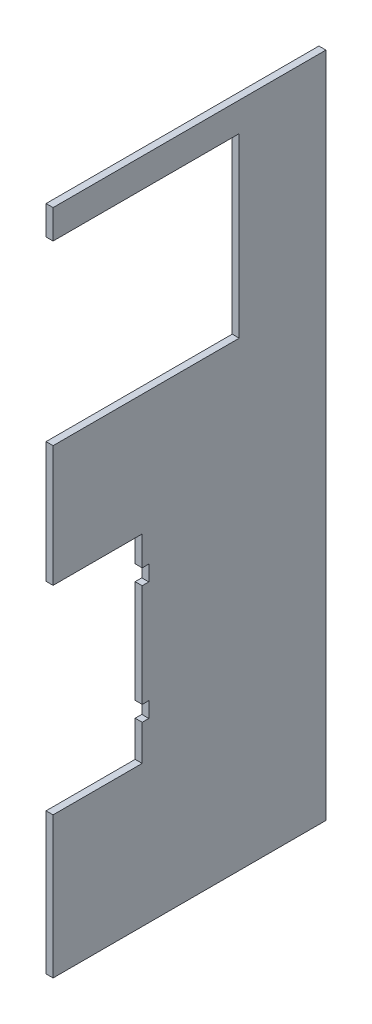
ISO-10303-21;
HEADER;
FILE_DESCRIPTION(('STEP AP214'),'2;1');
FILE_NAME('part.step','',(''),(''),'','','');
FILE_SCHEMA(('AUTOMOTIVE_DESIGN { 1 0 10303 214 1 1 1 1 }'));
ENDSEC;
DATA;
#1=APPLICATION_CONTEXT('core data for automotive mechanical design processes');
#2=APPLICATION_PROTOCOL_DEFINITION('international standard','automotive_design',2000,#1);
#3=PRODUCT_CONTEXT('',#1,'mechanical');
#4=PRODUCT('Part','Part','',(#3));
#5=PRODUCT_RELATED_PRODUCT_CATEGORY('part','',(#4));
#6=PRODUCT_DEFINITION_FORMATION('','',#4);
#7=PRODUCT_DEFINITION_CONTEXT('part definition',#1,'design');
#8=PRODUCT_DEFINITION('design','',#6,#7);
#9=PRODUCT_DEFINITION_SHAPE('','',#8);
#10=(LENGTH_UNIT() NAMED_UNIT(*) SI_UNIT(.MILLI.,.METRE.));
#11=(NAMED_UNIT(*) PLANE_ANGLE_UNIT() SI_UNIT($,.RADIAN.));
#12=(NAMED_UNIT(*) SI_UNIT($,.STERADIAN.) SOLID_ANGLE_UNIT());
#13=UNCERTAINTY_MEASURE_WITH_UNIT(LENGTH_MEASURE(1.E-05),#10,'distance_accuracy_value','');
#14=(GEOMETRIC_REPRESENTATION_CONTEXT(3) GLOBAL_UNCERTAINTY_ASSIGNED_CONTEXT((#13)) GLOBAL_UNIT_ASSIGNED_CONTEXT((#10,
#11,#12)) REPRESENTATION_CONTEXT('',''));
#15=CARTESIAN_POINT('',(0.,0.,0.));
#16=DIRECTION('',(0.,0.,1.));
#17=DIRECTION('',(1.,0.,0.));
#18=AXIS2_PLACEMENT_3D('',#15,#16,#17);
#19=CARTESIAN_POINT('',(1.,5.85000000000012,42.25));
#20=DIRECTION('',(0.,0.,1.));
#21=DIRECTION('',(0.,-1.,0.));
#22=AXIS2_PLACEMENT_3D('',#19,#20,#21);
#23=PLANE('',#22);
#24=DIRECTION('',(1.,0.,0.));
#25=VECTOR('',#24,1.);
#26=CARTESIAN_POINT('',(1.,25.9691599433872,42.25));
#27=LINE('',#26,#25);
#28=CARTESIAN_POINT('',(0.,25.9691599433872,42.25));
#29=VERTEX_POINT('',#28);
#30=CARTESIAN_POINT('',(1.,25.9691599433872,42.25));
#31=VERTEX_POINT('',#30);
#32=EDGE_CURVE('E282',#29,#31,#27,.T.);
#33=ORIENTED_EDGE('',*,*,#32,.F.);
#34=DIRECTION('',(0.,1.,0.));
#35=VECTOR('',#34,1.);
#36=CARTESIAN_POINT('',(0.,100.85,42.25));
#37=LINE('',#36,#35);
#38=CARTESIAN_POINT('',(0.,5.85000000000012,42.25));
#39=VERTEX_POINT('',#38);
#40=EDGE_CURVE('E285',#39,#29,#37,.T.);
#41=ORIENTED_EDGE('',*,*,#40,.F.);
#42=DIRECTION('',(-1.,0.,0.));
#43=VECTOR('',#42,1.);
#44=CARTESIAN_POINT('',(1.,5.85000000000012,42.25));
#45=LINE('',#44,#43);
#46=CARTESIAN_POINT('',(1.,5.85000000000012,42.25));
#47=VERTEX_POINT('',#46);
#48=EDGE_CURVE('E311',#47,#39,#45,.T.);
#49=ORIENTED_EDGE('',*,*,#48,.F.);
#50=DIRECTION('',(0.,1.,0.));
#51=VECTOR('',#50,1.);
#52=CARTESIAN_POINT('',(1.,5.85000000000012,42.25));
#53=LINE('',#52,#51);
#54=EDGE_CURVE('E302',#47,#31,#53,.T.);
#55=ORIENTED_EDGE('',*,*,#54,.T.);
#56=EDGE_LOOP('',(#33,#41,#49,#55));
#57=FACE_BOUND('',#56,.T.);
#58=ADVANCED_FACE('F32',(#57),#23,.T.);
#59=DIRECTION('',(-1.,0.,0.));
#60=VECTOR('',#59,1.);
#61=CARTESIAN_POINT('',(1.,96.7206720583192,42.25));
#62=LINE('',#61,#60);
#63=CARTESIAN_POINT('',(1.,96.7206720583192,42.25));
#64=VERTEX_POINT('',#63);
#65=CARTESIAN_POINT('',(0.,96.7206720583192,42.25));
#66=VERTEX_POINT('',#65);
#67=EDGE_CURVE('E279',#64,#66,#62,.T.);
#68=ORIENTED_EDGE('',*,*,#67,.F.);
#69=CARTESIAN_POINT('',(1.,100.85,42.25));
#70=VERTEX_POINT('',#69);
#71=EDGE_CURVE('E301',#64,#70,#53,.T.);
#72=ORIENTED_EDGE('',*,*,#71,.T.);
#73=DIRECTION('',(-1.,0.,0.));
#74=VECTOR('',#73,1.);
#75=CARTESIAN_POINT('',(1.,100.85,42.25));
#76=LINE('',#75,#74);
#77=CARTESIAN_POINT('',(0.,100.85,42.25));
#78=VERTEX_POINT('',#77);
#79=EDGE_CURVE('E316',#70,#78,#76,.T.);
#80=ORIENTED_EDGE('',*,*,#79,.T.);
#81=EDGE_CURVE('E284',#66,#78,#37,.T.);
#82=ORIENTED_EDGE('',*,*,#81,.F.);
#83=EDGE_LOOP('',(#68,#72,#80,#82));
#84=FACE_BOUND('',#83,.T.);
#85=ADVANCED_FACE('F327',(#84),#23,.T.);
#86=CARTESIAN_POINT('',(1.,5.85000000000011,3.40000000000003));
#87=DIRECTION('',(0.,-1.,0.));
#88=DIRECTION('',(0.,0.,-1.));
#89=AXIS2_PLACEMENT_3D('',#86,#87,#88);
#90=PLANE('',#89);
#91=ORIENTED_EDGE('',*,*,#48,.T.);
#92=DIRECTION('',(0.,0.,1.));
#93=VECTOR('',#92,1.);
#94=CARTESIAN_POINT('',(0.,5.85000000000012,42.25));
#95=LINE('',#94,#93);
#96=CARTESIAN_POINT('',(0.,5.85000000000011,3.40000000000002));
#97=VERTEX_POINT('',#96);
#98=EDGE_CURVE('E295',#97,#39,#95,.T.);
#99=ORIENTED_EDGE('',*,*,#98,.F.);
#100=DIRECTION('',(-1.,0.,0.));
#101=VECTOR('',#100,1.);
#102=CARTESIAN_POINT('',(1.,5.85000000000011,3.40000000000003));
#103=LINE('',#102,#101);
#104=CARTESIAN_POINT('',(1.,5.85000000000011,3.40000000000003));
#105=VERTEX_POINT('',#104);
#106=EDGE_CURVE('E312',#105,#97,#103,.T.);
#107=ORIENTED_EDGE('',*,*,#106,.F.);
#108=DIRECTION('',(0.,0.,1.));
#109=VECTOR('',#108,1.);
#110=CARTESIAN_POINT('',(1.,5.85000000000011,3.40000000000003));
#111=LINE('',#110,#109);
#112=EDGE_CURVE('E298',#105,#47,#111,.T.);
#113=ORIENTED_EDGE('',*,*,#112,.T.);
#114=EDGE_LOOP('',(#91,#99,#107,#113));
#115=FACE_BOUND('',#114,.T.);
#116=ADVANCED_FACE('F34',(#115),#90,.T.);
#117=CARTESIAN_POINT('',(1.,100.85,3.40000000000002));
#118=DIRECTION('',(0.,0.,-1.));
#119=DIRECTION('',(0.,1.,0.));
#120=AXIS2_PLACEMENT_3D('',#117,#118,#119);
#121=PLANE('',#120);
#122=ORIENTED_EDGE('',*,*,#106,.T.);
#123=DIRECTION('',(0.,-1.,0.));
#124=VECTOR('',#123,1.);
#125=CARTESIAN_POINT('',(0.,5.85000000000011,3.40000000000002));
#126=LINE('',#125,#124);
#127=CARTESIAN_POINT('',(0.,100.85,3.40000000000002));
#128=VERTEX_POINT('',#127);
#129=EDGE_CURVE('E292',#128,#97,#126,.T.);
#130=ORIENTED_EDGE('',*,*,#129,.F.);
#131=DIRECTION('',(-1.,0.,0.));
#132=VECTOR('',#131,1.);
#133=CARTESIAN_POINT('',(1.,100.85,3.40000000000002));
#134=LINE('',#133,#132);
#135=CARTESIAN_POINT('',(1.,100.85,3.40000000000002));
#136=VERTEX_POINT('',#135);
#137=EDGE_CURVE('E314',#136,#128,#134,.T.);
#138=ORIENTED_EDGE('',*,*,#137,.F.);
#139=DIRECTION('',(0.,-1.,0.));
#140=VECTOR('',#139,1.);
#141=CARTESIAN_POINT('',(1.,100.85,3.40000000000002));
#142=LINE('',#141,#140);
#143=EDGE_CURVE('E308',#136,#105,#142,.T.);
#144=ORIENTED_EDGE('',*,*,#143,.T.);
#145=EDGE_LOOP('',(#122,#130,#138,#144));
#146=FACE_BOUND('',#145,.T.);
#147=ADVANCED_FACE('F366',(#146),#121,.T.);
#148=CARTESIAN_POINT('',(1.,100.85,42.25));
#149=DIRECTION('',(0.,1.,0.));
#150=DIRECTION('',(0.,0.,1.));
#151=AXIS2_PLACEMENT_3D('',#148,#149,#150);
#152=PLANE('',#151);
#153=ORIENTED_EDGE('',*,*,#137,.T.);
#154=DIRECTION('',(0.,0.,-1.));
#155=VECTOR('',#154,1.);
#156=CARTESIAN_POINT('',(0.,100.85,3.40000000000002));
#157=LINE('',#156,#155);
#158=EDGE_CURVE('E288',#78,#128,#157,.T.);
#159=ORIENTED_EDGE('',*,*,#158,.F.);
#160=ORIENTED_EDGE('',*,*,#79,.F.);
#161=DIRECTION('',(0.,0.,-1.));
#162=VECTOR('',#161,1.);
#163=CARTESIAN_POINT('',(1.,100.85,42.25));
#164=LINE('',#163,#162);
#165=EDGE_CURVE('E305',#70,#136,#164,.T.);
#166=ORIENTED_EDGE('',*,*,#165,.T.);
#167=EDGE_LOOP('',(#153,#159,#160,#166));
#168=FACE_BOUND('',#167,.T.);
#169=ADVANCED_FACE('F360',(#168),#152,.T.);
#170=DIRECTION('',(-1.,0.,0.));
#171=VECTOR('',#170,1.);
#172=CARTESIAN_POINT('',(1.,54.2619783963912,42.25));
#173=LINE('',#172,#171);
#174=CARTESIAN_POINT('',(1.,54.2619783963912,42.25));
#175=VERTEX_POINT('',#174);
#176=CARTESIAN_POINT('',(0.,54.2619783963912,42.25));
#177=VERTEX_POINT('',#176);
#178=EDGE_CURVE('E55',#175,#177,#173,.T.);
#179=ORIENTED_EDGE('',*,*,#178,.F.);
#180=CARTESIAN_POINT('',(1.,71.4932965354642,42.25));
#181=VERTEX_POINT('',#180);
#182=EDGE_CURVE('E191',#175,#181,#53,.T.);
#183=ORIENTED_EDGE('',*,*,#182,.T.);
#184=DIRECTION('',(1.,0.,0.));
#185=VECTOR('',#184,1.);
#186=CARTESIAN_POINT('',(1.,71.4932965354642,42.25));
#187=LINE('',#186,#185);
#188=CARTESIAN_POINT('',(0.,71.4932965354642,42.25));
#189=VERTEX_POINT('',#188);
#190=EDGE_CURVE('E248',#189,#181,#187,.T.);
#191=ORIENTED_EDGE('',*,*,#190,.F.);
#192=EDGE_CURVE('E289',#177,#189,#37,.T.);
#193=ORIENTED_EDGE('',*,*,#192,.F.);
#194=EDGE_LOOP('',(#179,#183,#191,#193));
#195=FACE_BOUND('',#194,.T.);
#196=ADVANCED_FACE('F335',(#195),#23,.T.);
#197=CARTESIAN_POINT('',(1.,0.,0.));
#198=DIRECTION('',(-1.,0.,0.));
#199=DIRECTION('',(0.,0.,1.));
#200=AXIS2_PLACEMENT_3D('',#197,#198,#199);
#201=PLANE('',#200);
#202=DIRECTION('',(0.,-1.,0.));
#203=VECTOR('',#202,1.);
#204=CARTESIAN_POINT('',(1.,31.0387265210751,29.5622880308028));
#205=LINE('',#204,#203);
#206=CARTESIAN_POINT('',(1.,31.0387265210751,29.5622880308028));
#207=VERTEX_POINT('',#206);
#208=CARTESIAN_POINT('',(1.,25.9691599433872,29.5622880308028));
#209=VERTEX_POINT('',#208);
#210=EDGE_CURVE('E216',#207,#209,#205,.T.);
#211=ORIENTED_EDGE('',*,*,#210,.T.);
#212=DIRECTION('',(0.,0.,1.));
#213=VECTOR('',#212,1.);
#214=CARTESIAN_POINT('',(1.,25.9691599433872,47.1871750149511));
#215=LINE('',#214,#213);
#216=EDGE_CURVE('E176',#209,#31,#215,.T.);
#217=ORIENTED_EDGE('',*,*,#216,.T.);
#218=ORIENTED_EDGE('',*,*,#54,.F.);
#219=ORIENTED_EDGE('',*,*,#112,.F.);
#220=ORIENTED_EDGE('',*,*,#143,.F.);
#221=ORIENTED_EDGE('',*,*,#165,.F.);
#222=ORIENTED_EDGE('',*,*,#71,.F.);
#223=DIRECTION('',(0.,0.,-1.));
#224=VECTOR('',#223,1.);
#225=CARTESIAN_POINT('',(1.,96.7206720583192,15.7452932217527));
#226=LINE('',#225,#224);
#227=CARTESIAN_POINT('',(1.,96.7206720583192,15.7452932217527));
#228=VERTEX_POINT('',#227);
#229=EDGE_CURVE('E270',#64,#228,#226,.T.);
#230=ORIENTED_EDGE('',*,*,#229,.T.);
#231=DIRECTION('',(0.,-1.,0.));
#232=VECTOR('',#231,1.);
#233=CARTESIAN_POINT('',(1.,96.7206720583192,15.7452932217527));
#234=LINE('',#233,#232);
#235=CARTESIAN_POINT('',(1.,71.4932965354642,15.7452932217527));
#236=VERTEX_POINT('',#235);
#237=EDGE_CURVE('E264',#228,#236,#234,.T.);
#238=ORIENTED_EDGE('',*,*,#237,.T.);
#239=DIRECTION('',(0.,0.,1.));
#240=VECTOR('',#239,1.);
#241=CARTESIAN_POINT('',(1.,71.4932965354642,15.7452932217527));
#242=LINE('',#241,#240);
#243=EDGE_CURVE('E267',#236,#181,#242,.T.);
#244=ORIENTED_EDGE('',*,*,#243,.T.);
#245=ORIENTED_EDGE('',*,*,#182,.F.);
#246=DIRECTION('',(0.,0.,-1.));
#247=VECTOR('',#246,1.);
#248=CARTESIAN_POINT('',(1.,54.2619783963912,47.1871750149511));
#249=LINE('',#248,#247);
#250=CARTESIAN_POINT('',(1.,54.2619783963912,29.5622880308028));
#251=VERTEX_POINT('',#250);
#252=EDGE_CURVE('E171',#175,#251,#249,.T.);
#253=ORIENTED_EDGE('',*,*,#252,.T.);
#254=DIRECTION('',(0.,-1.,0.));
#255=VECTOR('',#254,1.);
#256=CARTESIAN_POINT('',(1.,54.2619783963912,29.5622880308028));
#257=LINE('',#256,#255);
#258=CARTESIAN_POINT('',(1.,50.0787265210751,29.5622880308028));
#259=VERTEX_POINT('',#258);
#260=EDGE_CURVE('E179',#251,#259,#257,.T.);
#261=ORIENTED_EDGE('',*,*,#260,.T.);
#262=DIRECTION('',(0.,0.,-1.));
#263=VECTOR('',#262,1.);
#264=CARTESIAN_POINT('',(1.,50.0787265210751,29.5622880308028));
#265=LINE('',#264,#263);
#266=CARTESIAN_POINT('',(1.,50.0787265210751,28.6188892282582));
#267=VERTEX_POINT('',#266);
#268=EDGE_CURVE('E184',#259,#267,#265,.T.);
#269=ORIENTED_EDGE('',*,*,#268,.T.);
#270=DIRECTION('',(0.,-1.,0.));
#271=VECTOR('',#270,1.);
#272=CARTESIAN_POINT('',(1.,50.0787265210751,28.6188892282582));
#273=LINE('',#272,#271);
#274=CARTESIAN_POINT('',(1.,47.8787265210751,28.6188892282582));
#275=VERTEX_POINT('',#274);
#276=EDGE_CURVE('E198',#267,#275,#273,.T.);
#277=ORIENTED_EDGE('',*,*,#276,.T.);
#278=DIRECTION('',(0.,0.,1.));
#279=VECTOR('',#278,1.);
#280=CARTESIAN_POINT('',(1.,47.8787265210751,28.6188892282582));
#281=LINE('',#280,#279);
#282=CARTESIAN_POINT('',(1.,47.8787265210751,29.5622880308028));
#283=VERTEX_POINT('',#282);
#284=EDGE_CURVE('E201',#275,#283,#281,.T.);
#285=ORIENTED_EDGE('',*,*,#284,.T.);
#286=DIRECTION('',(0.,-1.,0.));
#287=VECTOR('',#286,1.);
#288=CARTESIAN_POINT('',(1.,47.8787265210751,29.5622880308028));
#289=LINE('',#288,#287);
#290=CARTESIAN_POINT('',(1.,33.2387265210751,29.5622880308028));
#291=VERTEX_POINT('',#290);
#292=EDGE_CURVE('E204',#283,#291,#289,.T.);
#293=ORIENTED_EDGE('',*,*,#292,.T.);
#294=DIRECTION('',(0.,0.,-1.));
#295=VECTOR('',#294,1.);
#296=CARTESIAN_POINT('',(1.,33.2387265210751,29.5622880308028));
#297=LINE('',#296,#295);
#298=CARTESIAN_POINT('',(1.,33.2387265210751,28.6188892282582));
#299=VERTEX_POINT('',#298);
#300=EDGE_CURVE('E207',#291,#299,#297,.T.);
#301=ORIENTED_EDGE('',*,*,#300,.T.);
#302=DIRECTION('',(0.,-1.,0.));
#303=VECTOR('',#302,1.);
#304=CARTESIAN_POINT('',(1.,33.2387265210751,28.6188892282582));
#305=LINE('',#304,#303);
#306=CARTESIAN_POINT('',(1.,31.0387265210751,28.6188892282582));
#307=VERTEX_POINT('',#306);
#308=EDGE_CURVE('E210',#299,#307,#305,.T.);
#309=ORIENTED_EDGE('',*,*,#308,.T.);
#310=DIRECTION('',(0.,0.,1.));
#311=VECTOR('',#310,1.);
#312=CARTESIAN_POINT('',(1.,31.0387265210751,28.6188892282582));
#313=LINE('',#312,#311);
#314=EDGE_CURVE('E213',#307,#207,#313,.T.);
#315=ORIENTED_EDGE('',*,*,#314,.T.);
#316=EDGE_LOOP('',(#211,#217,#218,#219,#220,#221,#222,#230,#238,#244,#245,#253,#261,#269,#277,
#285,#293,#301,#309,#315));
#317=FACE_BOUND('',#316,.T.);
#318=ADVANCED_FACE('F188',(#317),#201,.F.);
#319=CARTESIAN_POINT('',(0.,0.,0.));
#320=DIRECTION('',(1.,0.,0.));
#321=DIRECTION('',(0.,0.,-1.));
#322=AXIS2_PLACEMENT_3D('',#319,#320,#321);
#323=PLANE('',#322);
#324=ORIENTED_EDGE('',*,*,#40,.T.);
#325=DIRECTION('',(0.,0.,1.));
#326=VECTOR('',#325,1.);
#327=CARTESIAN_POINT('',(0.,25.9691599433872,47.1871750149511));
#328=LINE('',#327,#326);
#329=CARTESIAN_POINT('',(0.,25.9691599433872,29.5622880308028));
#330=VERTEX_POINT('',#329);
#331=EDGE_CURVE('E192',#330,#29,#328,.T.);
#332=ORIENTED_EDGE('',*,*,#331,.F.);
#333=DIRECTION('',(0.,-1.,0.));
#334=VECTOR('',#333,1.);
#335=CARTESIAN_POINT('',(0.,31.0387265210751,29.5622880308028));
#336=LINE('',#335,#334);
#337=CARTESIAN_POINT('',(0.,31.0387265210751,29.5622880308028));
#338=VERTEX_POINT('',#337);
#339=EDGE_CURVE('E194',#338,#330,#336,.T.);
#340=ORIENTED_EDGE('',*,*,#339,.F.);
#341=DIRECTION('',(0.,0.,1.));
#342=VECTOR('',#341,1.);
#343=CARTESIAN_POINT('',(0.,31.0387265210751,28.6188892282582));
#344=LINE('',#343,#342);
#345=CARTESIAN_POINT('',(0.,31.0387265210751,28.6188892282582));
#346=VERTEX_POINT('',#345);
#347=EDGE_CURVE('E241',#346,#338,#344,.T.);
#348=ORIENTED_EDGE('',*,*,#347,.F.);
#349=DIRECTION('',(0.,-1.,0.));
#350=VECTOR('',#349,1.);
#351=CARTESIAN_POINT('',(0.,33.2387265210751,28.6188892282582));
#352=LINE('',#351,#350);
#353=CARTESIAN_POINT('',(0.,33.2387265210751,28.6188892282582));
#354=VERTEX_POINT('',#353);
#355=EDGE_CURVE('E238',#354,#346,#352,.T.);
#356=ORIENTED_EDGE('',*,*,#355,.F.);
#357=DIRECTION('',(0.,0.,-1.));
#358=VECTOR('',#357,1.);
#359=CARTESIAN_POINT('',(0.,33.2387265210751,29.5622880308028));
#360=LINE('',#359,#358);
#361=CARTESIAN_POINT('',(0.,33.2387265210751,29.5622880308028));
#362=VERTEX_POINT('',#361);
#363=EDGE_CURVE('E235',#362,#354,#360,.T.);
#364=ORIENTED_EDGE('',*,*,#363,.F.);
#365=DIRECTION('',(0.,-1.,0.));
#366=VECTOR('',#365,1.);
#367=CARTESIAN_POINT('',(0.,47.8787265210751,29.5622880308028));
#368=LINE('',#367,#366);
#369=CARTESIAN_POINT('',(0.,47.8787265210751,29.5622880308028));
#370=VERTEX_POINT('',#369);
#371=EDGE_CURVE('E232',#370,#362,#368,.T.);
#372=ORIENTED_EDGE('',*,*,#371,.F.);
#373=DIRECTION('',(0.,0.,1.));
#374=VECTOR('',#373,1.);
#375=CARTESIAN_POINT('',(0.,47.8787265210751,28.6188892282582));
#376=LINE('',#375,#374);
#377=CARTESIAN_POINT('',(0.,47.8787265210751,28.6188892282582));
#378=VERTEX_POINT('',#377);
#379=EDGE_CURVE('E229',#378,#370,#376,.T.);
#380=ORIENTED_EDGE('',*,*,#379,.F.);
#381=DIRECTION('',(0.,-1.,0.));
#382=VECTOR('',#381,1.);
#383=CARTESIAN_POINT('',(0.,50.0787265210751,28.6188892282582));
#384=LINE('',#383,#382);
#385=CARTESIAN_POINT('',(0.,50.0787265210751,28.6188892282582));
#386=VERTEX_POINT('',#385);
#387=EDGE_CURVE('E226',#386,#378,#384,.T.);
#388=ORIENTED_EDGE('',*,*,#387,.F.);
#389=DIRECTION('',(0.,0.,-1.));
#390=VECTOR('',#389,1.);
#391=CARTESIAN_POINT('',(0.,50.0787265210751,29.5622880308028));
#392=LINE('',#391,#390);
#393=CARTESIAN_POINT('',(0.,50.0787265210751,29.5622880308028));
#394=VERTEX_POINT('',#393);
#395=EDGE_CURVE('E222',#394,#386,#392,.T.);
#396=ORIENTED_EDGE('',*,*,#395,.F.);
#397=DIRECTION('',(0.,-1.,0.));
#398=VECTOR('',#397,1.);
#399=CARTESIAN_POINT('',(0.,54.2619783963912,29.5622880308028));
#400=LINE('',#399,#398);
#401=CARTESIAN_POINT('',(0.,54.2619783963912,29.5622880308028));
#402=VERTEX_POINT('',#401);
#403=EDGE_CURVE('E220',#402,#394,#400,.T.);
#404=ORIENTED_EDGE('',*,*,#403,.F.);
#405=DIRECTION('',(0.,0.,1.));
#406=VECTOR('',#405,1.);
#407=CARTESIAN_POINT('',(0.,54.2619783963912,0.));
#408=LINE('',#407,#406);
#409=EDGE_CURVE('E11',#402,#177,#408,.T.);
#410=ORIENTED_EDGE('',*,*,#409,.T.);
#411=ORIENTED_EDGE('',*,*,#192,.T.);
#412=DIRECTION('',(0.,0.,1.));
#413=VECTOR('',#412,1.);
#414=CARTESIAN_POINT('',(0.,71.4932965354642,15.7452932217527));
#415=LINE('',#414,#413);
#416=CARTESIAN_POINT('',(0.,71.4932965354642,15.7452932217527));
#417=VERTEX_POINT('',#416);
#418=EDGE_CURVE('E268',#417,#189,#415,.T.);
#419=ORIENTED_EDGE('',*,*,#418,.F.);
#420=DIRECTION('',(0.,-1.,0.));
#421=VECTOR('',#420,1.);
#422=CARTESIAN_POINT('',(0.,96.7206720583192,15.7452932217527));
#423=LINE('',#422,#421);
#424=CARTESIAN_POINT('',(0.,96.7206720583192,15.7452932217527));
#425=VERTEX_POINT('',#424);
#426=EDGE_CURVE('E47',#425,#417,#423,.T.);
#427=ORIENTED_EDGE('',*,*,#426,.F.);
#428=DIRECTION('',(0.,0.,1.));
#429=VECTOR('',#428,1.);
#430=CARTESIAN_POINT('',(0.,96.7206720583192,0.));
#431=LINE('',#430,#429);
#432=EDGE_CURVE('E40',#425,#66,#431,.T.);
#433=ORIENTED_EDGE('',*,*,#432,.T.);
#434=ORIENTED_EDGE('',*,*,#81,.T.);
#435=ORIENTED_EDGE('',*,*,#158,.T.);
#436=ORIENTED_EDGE('',*,*,#129,.T.);
#437=ORIENTED_EDGE('',*,*,#98,.T.);
#438=EDGE_LOOP('',(#324,#332,#340,#348,#356,#364,#372,#380,#388,#396,#404,#410,#411,#419,#427,
#433,#434,#435,#436,#437));
#439=FACE_BOUND('',#438,.T.);
#440=ADVANCED_FACE('F322',(#439),#323,.F.);
#441=CARTESIAN_POINT('',(1.,96.7206720583192,15.7452932217527));
#442=DIRECTION('',(0.,0.,-1.));
#443=DIRECTION('',(0.,1.,0.));
#444=AXIS2_PLACEMENT_3D('',#441,#442,#443);
#445=PLANE('',#444);
#446=ORIENTED_EDGE('',*,*,#426,.T.);
#447=DIRECTION('',(-1.,0.,0.));
#448=VECTOR('',#447,1.);
#449=CARTESIAN_POINT('',(1.,71.4932965354642,15.7452932217527));
#450=LINE('',#449,#448);
#451=EDGE_CURVE('E273',#236,#417,#450,.T.);
#452=ORIENTED_EDGE('',*,*,#451,.F.);
#453=ORIENTED_EDGE('',*,*,#237,.F.);
#454=DIRECTION('',(-1.,0.,0.));
#455=VECTOR('',#454,1.);
#456=CARTESIAN_POINT('',(1.,96.7206720583192,15.7452932217527));
#457=LINE('',#456,#455);
#458=EDGE_CURVE('E223',#228,#425,#457,.T.);
#459=ORIENTED_EDGE('',*,*,#458,.T.);
#460=EDGE_LOOP('',(#446,#452,#453,#459));
#461=FACE_BOUND('',#460,.T.);
#462=ADVANCED_FACE('F340',(#461),#445,.F.);
#463=CARTESIAN_POINT('',(1.,96.7206720583192,15.7452932217527));
#464=DIRECTION('',(0.,1.,0.));
#465=DIRECTION('',(0.,0.,1.));
#466=AXIS2_PLACEMENT_3D('',#463,#464,#465);
#467=PLANE('',#466);
#468=ORIENTED_EDGE('',*,*,#67,.T.);
#469=ORIENTED_EDGE('',*,*,#432,.F.);
#470=ORIENTED_EDGE('',*,*,#458,.F.);
#471=ORIENTED_EDGE('',*,*,#229,.F.);
#472=EDGE_LOOP('',(#468,#469,#470,#471));
#473=FACE_BOUND('',#472,.T.);
#474=ADVANCED_FACE('F341',(#473),#467,.F.);
#475=CARTESIAN_POINT('',(1.,71.4932965354642,15.7452932217527));
#476=DIRECTION('',(0.,-1.,0.));
#477=DIRECTION('',(0.,0.,-1.));
#478=AXIS2_PLACEMENT_3D('',#475,#476,#477);
#479=PLANE('',#478);
#480=ORIENTED_EDGE('',*,*,#190,.T.);
#481=ORIENTED_EDGE('',*,*,#243,.F.);
#482=ORIENTED_EDGE('',*,*,#451,.T.);
#483=ORIENTED_EDGE('',*,*,#418,.T.);
#484=EDGE_LOOP('',(#480,#481,#482,#483));
#485=FACE_BOUND('',#484,.T.);
#486=ADVANCED_FACE('F338',(#485),#479,.F.);
#487=CARTESIAN_POINT('',(1.,25.9691599433872,47.1871750149511));
#488=DIRECTION('',(0.,-1.,0.));
#489=DIRECTION('',(0.,0.,-1.));
#490=AXIS2_PLACEMENT_3D('',#487,#488,#489);
#491=PLANE('',#490);
#492=ORIENTED_EDGE('',*,*,#32,.T.);
#493=ORIENTED_EDGE('',*,*,#216,.F.);
#494=DIRECTION('',(-1.,0.,0.));
#495=VECTOR('',#494,1.);
#496=CARTESIAN_POINT('',(1.,25.9691599433872,29.5622880308028));
#497=LINE('',#496,#495);
#498=EDGE_CURVE('E246',#209,#330,#497,.T.);
#499=ORIENTED_EDGE('',*,*,#498,.T.);
#500=ORIENTED_EDGE('',*,*,#331,.T.);
#501=EDGE_LOOP('',(#492,#493,#499,#500));
#502=FACE_BOUND('',#501,.T.);
#503=ADVANCED_FACE('F348',(#502),#491,.F.);
#504=CARTESIAN_POINT('',(1.,31.0387265210751,29.5622880308028));
#505=DIRECTION('',(0.,0.,-1.));
#506=DIRECTION('',(-1.,0.,0.));
#507=AXIS2_PLACEMENT_3D('',#504,#505,#506);
#508=PLANE('',#507);
#509=ORIENTED_EDGE('',*,*,#339,.T.);
#510=ORIENTED_EDGE('',*,*,#498,.F.);
#511=ORIENTED_EDGE('',*,*,#210,.F.);
#512=DIRECTION('',(-1.,0.,0.));
#513=VECTOR('',#512,1.);
#514=CARTESIAN_POINT('',(1.,31.0387265210751,29.5622880308028));
#515=LINE('',#514,#513);
#516=EDGE_CURVE('E249',#207,#338,#515,.T.);
#517=ORIENTED_EDGE('',*,*,#516,.T.);
#518=EDGE_LOOP('',(#509,#510,#511,#517));
#519=FACE_BOUND('',#518,.T.);
#520=ADVANCED_FACE('F403',(#519),#508,.F.);
#521=CARTESIAN_POINT('',(1.,31.0387265210751,28.6188892282582));
#522=DIRECTION('',(0.,-1.,0.));
#523=DIRECTION('',(0.,0.,-1.));
#524=AXIS2_PLACEMENT_3D('',#521,#522,#523);
#525=PLANE('',#524);
#526=ORIENTED_EDGE('',*,*,#347,.T.);
#527=ORIENTED_EDGE('',*,*,#516,.F.);
#528=ORIENTED_EDGE('',*,*,#314,.F.);
#529=DIRECTION('',(-1.,0.,0.));
#530=VECTOR('',#529,1.);
#531=CARTESIAN_POINT('',(1.,31.0387265210751,28.6188892282582));
#532=LINE('',#531,#530);
#533=EDGE_CURVE('E251',#307,#346,#532,.T.);
#534=ORIENTED_EDGE('',*,*,#533,.T.);
#535=EDGE_LOOP('',(#526,#527,#528,#534));
#536=FACE_BOUND('',#535,.T.);
#537=ADVANCED_FACE('F413',(#536),#525,.F.);
#538=CARTESIAN_POINT('',(1.,33.2387265210751,28.6188892282582));
#539=DIRECTION('',(0.,0.,-1.));
#540=DIRECTION('',(-1.,0.,0.));
#541=AXIS2_PLACEMENT_3D('',#538,#539,#540);
#542=PLANE('',#541);
#543=ORIENTED_EDGE('',*,*,#355,.T.);
#544=ORIENTED_EDGE('',*,*,#533,.F.);
#545=ORIENTED_EDGE('',*,*,#308,.F.);
#546=DIRECTION('',(-1.,0.,0.));
#547=VECTOR('',#546,1.);
#548=CARTESIAN_POINT('',(1.,33.2387265210751,28.6188892282582));
#549=LINE('',#548,#547);
#550=EDGE_CURVE('E253',#299,#354,#549,.T.);
#551=ORIENTED_EDGE('',*,*,#550,.T.);
#552=EDGE_LOOP('',(#543,#544,#545,#551));
#553=FACE_BOUND('',#552,.T.);
#554=ADVANCED_FACE('F423',(#553),#542,.F.);
#555=CARTESIAN_POINT('',(1.,33.2387265210751,29.5622880308028));
#556=DIRECTION('',(0.,1.,0.));
#557=DIRECTION('',(0.,0.,1.));
#558=AXIS2_PLACEMENT_3D('',#555,#556,#557);
#559=PLANE('',#558);
#560=ORIENTED_EDGE('',*,*,#363,.T.);
#561=ORIENTED_EDGE('',*,*,#550,.F.);
#562=ORIENTED_EDGE('',*,*,#300,.F.);
#563=DIRECTION('',(-1.,0.,0.));
#564=VECTOR('',#563,1.);
#565=CARTESIAN_POINT('',(1.,33.2387265210751,29.5622880308028));
#566=LINE('',#565,#564);
#567=EDGE_CURVE('E255',#291,#362,#566,.T.);
#568=ORIENTED_EDGE('',*,*,#567,.T.);
#569=EDGE_LOOP('',(#560,#561,#562,#568));
#570=FACE_BOUND('',#569,.T.);
#571=ADVANCED_FACE('F433',(#570),#559,.F.);
#572=CARTESIAN_POINT('',(1.,47.8787265210751,29.5622880308028));
#573=DIRECTION('',(0.,0.,-1.));
#574=DIRECTION('',(0.,1.,0.));
#575=AXIS2_PLACEMENT_3D('',#572,#573,#574);
#576=PLANE('',#575);
#577=ORIENTED_EDGE('',*,*,#371,.T.);
#578=ORIENTED_EDGE('',*,*,#567,.F.);
#579=ORIENTED_EDGE('',*,*,#292,.F.);
#580=DIRECTION('',(-1.,0.,0.));
#581=VECTOR('',#580,1.);
#582=CARTESIAN_POINT('',(1.,47.8787265210751,29.5622880308028));
#583=LINE('',#582,#581);
#584=EDGE_CURVE('E257',#283,#370,#583,.T.);
#585=ORIENTED_EDGE('',*,*,#584,.T.);
#586=EDGE_LOOP('',(#577,#578,#579,#585));
#587=FACE_BOUND('',#586,.T.);
#588=ADVANCED_FACE('F443',(#587),#576,.F.);
#589=CARTESIAN_POINT('',(1.,47.8787265210751,28.6188892282582));
#590=DIRECTION('',(0.,-1.,0.));
#591=DIRECTION('',(0.,0.,-1.));
#592=AXIS2_PLACEMENT_3D('',#589,#590,#591);
#593=PLANE('',#592);
#594=ORIENTED_EDGE('',*,*,#379,.T.);
#595=ORIENTED_EDGE('',*,*,#584,.F.);
#596=ORIENTED_EDGE('',*,*,#284,.F.);
#597=DIRECTION('',(-1.,0.,0.));
#598=VECTOR('',#597,1.);
#599=CARTESIAN_POINT('',(1.,47.8787265210751,28.6188892282582));
#600=LINE('',#599,#598);
#601=EDGE_CURVE('E259',#275,#378,#600,.T.);
#602=ORIENTED_EDGE('',*,*,#601,.T.);
#603=EDGE_LOOP('',(#594,#595,#596,#602));
#604=FACE_BOUND('',#603,.T.);
#605=ADVANCED_FACE('F453',(#604),#593,.F.);
#606=CARTESIAN_POINT('',(1.,50.0787265210751,28.6188892282582));
#607=DIRECTION('',(0.,0.,-1.));
#608=DIRECTION('',(-1.,0.,0.));
#609=AXIS2_PLACEMENT_3D('',#606,#607,#608);
#610=PLANE('',#609);
#611=ORIENTED_EDGE('',*,*,#387,.T.);
#612=ORIENTED_EDGE('',*,*,#601,.F.);
#613=ORIENTED_EDGE('',*,*,#276,.F.);
#614=DIRECTION('',(-1.,0.,0.));
#615=VECTOR('',#614,1.);
#616=CARTESIAN_POINT('',(1.,50.0787265210751,28.6188892282582));
#617=LINE('',#616,#615);
#618=EDGE_CURVE('E261',#267,#386,#617,.T.);
#619=ORIENTED_EDGE('',*,*,#618,.T.);
#620=EDGE_LOOP('',(#611,#612,#613,#619));
#621=FACE_BOUND('',#620,.T.);
#622=ADVANCED_FACE('F463',(#621),#610,.F.);
#623=CARTESIAN_POINT('',(1.,50.0787265210751,29.5622880308028));
#624=DIRECTION('',(0.,1.,0.));
#625=DIRECTION('',(0.,0.,1.));
#626=AXIS2_PLACEMENT_3D('',#623,#624,#625);
#627=PLANE('',#626);
#628=ORIENTED_EDGE('',*,*,#395,.T.);
#629=ORIENTED_EDGE('',*,*,#618,.F.);
#630=ORIENTED_EDGE('',*,*,#268,.F.);
#631=DIRECTION('',(-1.,0.,0.));
#632=VECTOR('',#631,1.);
#633=CARTESIAN_POINT('',(1.,50.0787265210751,29.5622880308028));
#634=LINE('',#633,#632);
#635=EDGE_CURVE('E175',#259,#394,#634,.T.);
#636=ORIENTED_EDGE('',*,*,#635,.T.);
#637=EDGE_LOOP('',(#628,#629,#630,#636));
#638=FACE_BOUND('',#637,.T.);
#639=ADVANCED_FACE('F473',(#638),#627,.F.);
#640=CARTESIAN_POINT('',(1.,54.2619783963912,29.5622880308028));
#641=DIRECTION('',(0.,0.,-1.));
#642=DIRECTION('',(-1.,0.,0.));
#643=AXIS2_PLACEMENT_3D('',#640,#641,#642);
#644=PLANE('',#643);
#645=ORIENTED_EDGE('',*,*,#403,.T.);
#646=ORIENTED_EDGE('',*,*,#635,.F.);
#647=ORIENTED_EDGE('',*,*,#260,.F.);
#648=DIRECTION('',(-1.,0.,0.));
#649=VECTOR('',#648,1.);
#650=CARTESIAN_POINT('',(1.,54.2619783963912,29.5622880308028));
#651=LINE('',#650,#649);
#652=EDGE_CURVE('E167',#251,#402,#651,.T.);
#653=ORIENTED_EDGE('',*,*,#652,.T.);
#654=EDGE_LOOP('',(#645,#646,#647,#653));
#655=FACE_BOUND('',#654,.T.);
#656=ADVANCED_FACE('F180',(#655),#644,.F.);
#657=CARTESIAN_POINT('',(1.,54.2619783963912,47.1871750149511));
#658=DIRECTION('',(0.,1.,0.));
#659=DIRECTION('',(0.,0.,1.));
#660=AXIS2_PLACEMENT_3D('',#657,#658,#659);
#661=PLANE('',#660);
#662=ORIENTED_EDGE('',*,*,#178,.T.);
#663=ORIENTED_EDGE('',*,*,#409,.F.);
#664=ORIENTED_EDGE('',*,*,#652,.F.);
#665=ORIENTED_EDGE('',*,*,#252,.F.);
#666=EDGE_LOOP('',(#662,#663,#664,#665));
#667=FACE_BOUND('',#666,.T.);
#668=ADVANCED_FACE('F169',(#667),#661,.F.);
#669=CLOSED_SHELL('',(#58,#85,#116,#147,#169,#196,#318,#440,#462,#474,#486,#503,#520,#537,#554,
#571,#588,#605,#622,#639,#656,#668));
#670=MANIFOLD_SOLID_BREP('B2',#669);
#671=ADVANCED_BREP_SHAPE_REPRESENTATION('',(#18,#670),#14);
#672=SHAPE_DEFINITION_REPRESENTATION(#9,#671);
ENDSEC;
END-ISO-10303-21;
